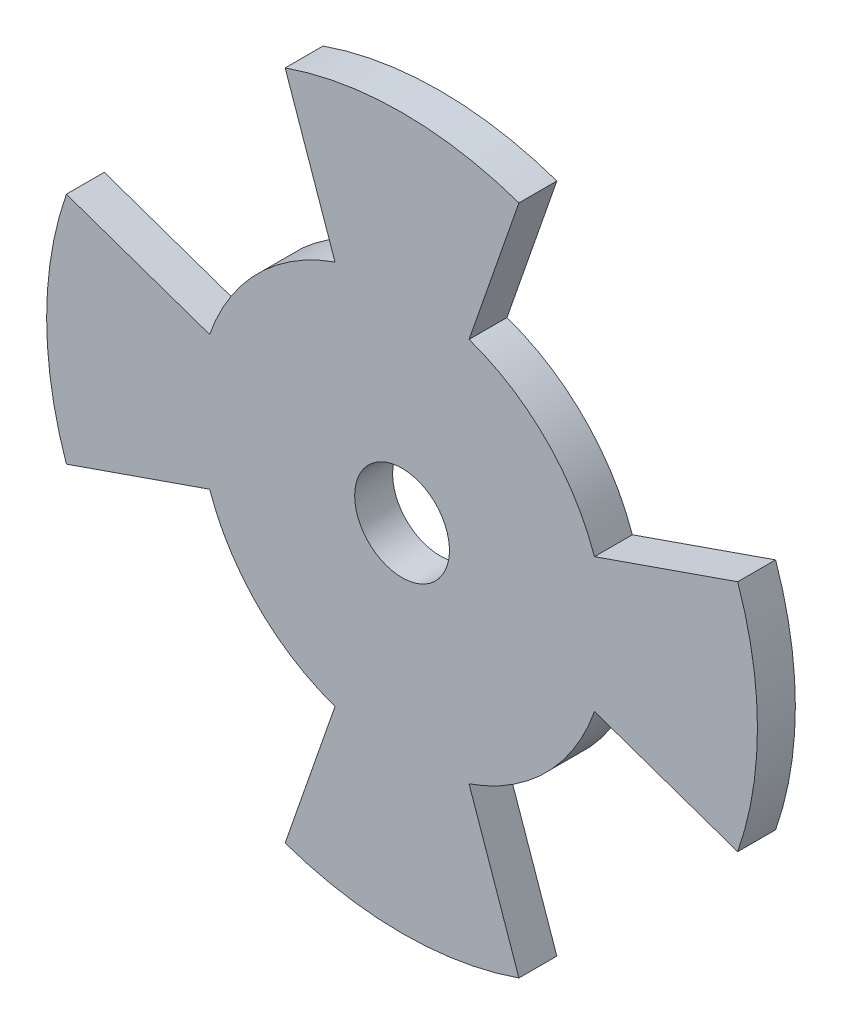
ISO-10303-21;
HEADER;
FILE_DESCRIPTION(('STEP AP214'),'2;1');
FILE_NAME('part.step','',(''),(''),'','','');
FILE_SCHEMA(('AUTOMOTIVE_DESIGN { 1 0 10303 214 1 1 1 1 }'));
ENDSEC;
DATA;
#1=APPLICATION_CONTEXT('core data for automotive mechanical design processes');
#2=APPLICATION_PROTOCOL_DEFINITION('international standard','automotive_design',2000,#1);
#3=PRODUCT_CONTEXT('',#1,'mechanical');
#4=PRODUCT('Part','Part','',(#3));
#5=PRODUCT_RELATED_PRODUCT_CATEGORY('part','',(#4));
#6=PRODUCT_DEFINITION_FORMATION('','',#4);
#7=PRODUCT_DEFINITION_CONTEXT('part definition',#1,'design');
#8=PRODUCT_DEFINITION('design','',#6,#7);
#9=PRODUCT_DEFINITION_SHAPE('','',#8);
#10=(LENGTH_UNIT() NAMED_UNIT(*) SI_UNIT(.MILLI.,.METRE.));
#11=(NAMED_UNIT(*) PLANE_ANGLE_UNIT() SI_UNIT($,.RADIAN.));
#12=(NAMED_UNIT(*) SI_UNIT($,.STERADIAN.) SOLID_ANGLE_UNIT());
#13=UNCERTAINTY_MEASURE_WITH_UNIT(LENGTH_MEASURE(1.E-05),#10,'distance_accuracy_value','');
#14=(GEOMETRIC_REPRESENTATION_CONTEXT(3) GLOBAL_UNCERTAINTY_ASSIGNED_CONTEXT((#13)) GLOBAL_UNIT_ASSIGNED_CONTEXT((#10,
#11,#12)) REPRESENTATION_CONTEXT('',''));
#15=CARTESIAN_POINT('',(0.,0.,0.));
#16=DIRECTION('',(0.,0.,1.));
#17=DIRECTION('',(1.,0.,0.));
#18=AXIS2_PLACEMENT_3D('',#15,#16,#17);
#19=CARTESIAN_POINT('',(0.,0.,2.));
#20=DIRECTION('',(0.,0.,-1.));
#21=DIRECTION('',(-1.,0.,0.));
#22=AXIS2_PLACEMENT_3D('',#19,#20,#21);
#23=CYLINDRICAL_SURFACE('',#22,18.75);
#24=CARTESIAN_POINT('',(0.,0.,0.));
#25=DIRECTION('',(0.,0.,1.));
#26=DIRECTION('',(1.,0.,0.));
#27=AXIS2_PLACEMENT_3D('',#24,#25,#26);
#28=CIRCLE('',#27,18.75);
#29=CARTESIAN_POINT('',(6.16703547130536,17.7067832622321,0.));
#30=VERTEX_POINT('',#29);
#31=CARTESIAN_POINT('',(-6.16703547130536,17.7067832622321,0.));
#32=VERTEX_POINT('',#31);
#33=EDGE_CURVE('E188',#30,#32,#28,.T.);
#34=ORIENTED_EDGE('',*,*,#33,.T.);
#35=DIRECTION('',(0.,0.,-1.));
#36=VECTOR('',#35,1.);
#37=CARTESIAN_POINT('',(-6.16703547130536,17.7067832622321,2.));
#38=LINE('',#37,#36);
#39=CARTESIAN_POINT('',(-6.16703547130536,17.7067832622321,2.));
#40=VERTEX_POINT('',#39);
#41=EDGE_CURVE('E11',#40,#32,#38,.T.);
#42=ORIENTED_EDGE('',*,*,#41,.F.);
#43=CARTESIAN_POINT('',(0.,0.,2.));
#44=DIRECTION('',(0.,0.,1.));
#45=DIRECTION('',(1.,0.,0.));
#46=AXIS2_PLACEMENT_3D('',#43,#44,#45);
#47=CIRCLE('',#46,18.75);
#48=CARTESIAN_POINT('',(6.16703547130536,17.7067832622321,2.));
#49=VERTEX_POINT('',#48);
#50=EDGE_CURVE('E235',#49,#40,#47,.T.);
#51=ORIENTED_EDGE('',*,*,#50,.F.);
#52=DIRECTION('',(0.,0.,-1.));
#53=VECTOR('',#52,1.);
#54=CARTESIAN_POINT('',(6.16703547130536,17.7067832622321,2.));
#55=LINE('',#54,#53);
#56=EDGE_CURVE('E184',#49,#30,#55,.T.);
#57=ORIENTED_EDGE('',*,*,#56,.T.);
#58=EDGE_LOOP('',(#34,#42,#51,#57));
#59=FACE_BOUND('',#58,.T.);
#60=ADVANCED_FACE('F39',(#59),#23,.T.);
#61=CARTESIAN_POINT('',(-3.53576700354841,10.1518890703464,2.));
#62=DIRECTION('',(0.94436177398571,0.328908558469619,0.));
#63=DIRECTION('',(-0.328908558469619,0.94436177398571,0.));
#64=AXIS2_PLACEMENT_3D('',#61,#62,#63);
#65=PLANE('',#64);
#66=DIRECTION('',(0.328908558469619,-0.94436177398571,0.));
#67=VECTOR('',#66,1.);
#68=CARTESIAN_POINT('',(-3.53576700354841,10.1518890703464,0.));
#69=LINE('',#68,#67);
#70=CARTESIAN_POINT('',(-3.53576700354841,10.1518890703464,0.));
#71=VERTEX_POINT('',#70);
#72=EDGE_CURVE('E192',#32,#71,#69,.T.);
#73=ORIENTED_EDGE('',*,*,#72,.T.);
#74=DIRECTION('',(0.,0.,-1.));
#75=VECTOR('',#74,1.);
#76=CARTESIAN_POINT('',(-3.53576700354841,10.1518890703464,2.));
#77=LINE('',#76,#75);
#78=CARTESIAN_POINT('',(-3.53576700354841,10.1518890703464,2.));
#79=VERTEX_POINT('',#78);
#80=EDGE_CURVE('E48',#79,#71,#77,.T.);
#81=ORIENTED_EDGE('',*,*,#80,.F.);
#82=DIRECTION('',(0.328908558469619,-0.94436177398571,0.));
#83=VECTOR('',#82,1.);
#84=CARTESIAN_POINT('',(-3.53576700354841,10.1518890703464,2.));
#85=LINE('',#84,#83);
#86=EDGE_CURVE('E123',#40,#79,#85,.T.);
#87=ORIENTED_EDGE('',*,*,#86,.F.);
#88=ORIENTED_EDGE('',*,*,#41,.T.);
#89=EDGE_LOOP('',(#73,#81,#87,#88));
#90=FACE_BOUND('',#89,.T.);
#91=ADVANCED_FACE('F358',(#90),#65,.F.);
#92=CARTESIAN_POINT('',(0.,0.,2.));
#93=DIRECTION('',(0.,0.,-1.));
#94=DIRECTION('',(-1.,0.,0.));
#95=AXIS2_PLACEMENT_3D('',#92,#93,#94);
#96=CYLINDRICAL_SURFACE('',#95,10.75);
#97=CARTESIAN_POINT('',(0.,0.,0.));
#98=DIRECTION('',(0.,0.,1.));
#99=DIRECTION('',(1.,0.,0.));
#100=AXIS2_PLACEMENT_3D('',#97,#98,#99);
#101=CIRCLE('',#100,10.75);
#102=CARTESIAN_POINT('',(-10.1518890703473,3.53576700354574,0.));
#103=VERTEX_POINT('',#102);
#104=EDGE_CURVE('E196',#71,#103,#101,.T.);
#105=ORIENTED_EDGE('',*,*,#104,.T.);
#106=DIRECTION('',(0.,0.,-1.));
#107=VECTOR('',#106,1.);
#108=CARTESIAN_POINT('',(-10.1518890703473,3.53576700354574,2.));
#109=LINE('',#108,#107);
#110=CARTESIAN_POINT('',(-10.1518890703473,3.53576700354574,2.));
#111=VERTEX_POINT('',#110);
#112=EDGE_CURVE('E278',#111,#103,#109,.T.);
#113=ORIENTED_EDGE('',*,*,#112,.F.);
#114=CARTESIAN_POINT('',(0.,0.,2.));
#115=DIRECTION('',(0.,0.,1.));
#116=DIRECTION('',(1.,0.,0.));
#117=AXIS2_PLACEMENT_3D('',#114,#115,#116);
#118=CIRCLE('',#117,10.75);
#119=EDGE_CURVE('E288',#79,#111,#118,.T.);
#120=ORIENTED_EDGE('',*,*,#119,.F.);
#121=ORIENTED_EDGE('',*,*,#80,.T.);
#122=EDGE_LOOP('',(#105,#113,#120,#121));
#123=FACE_BOUND('',#122,.T.);
#124=ADVANCED_FACE('F286',(#123),#96,.T.);
#125=CARTESIAN_POINT('',(-10.1518890703473,3.53576700354574,2.));
#126=DIRECTION('',(-0.328908558469371,-0.944361773985796,0.));
#127=DIRECTION('',(0.944361773985796,-0.328908558469371,0.));
#128=AXIS2_PLACEMENT_3D('',#125,#126,#127);
#129=PLANE('',#128);
#130=DIRECTION('',(-0.944361773985796,0.328908558469371,0.));
#131=VECTOR('',#130,1.);
#132=CARTESIAN_POINT('',(-10.1518890703473,3.53576700354574,0.));
#133=LINE('',#132,#131);
#134=CARTESIAN_POINT('',(-17.7067832622337,6.16703547130071,0.));
#135=VERTEX_POINT('',#134);
#136=EDGE_CURVE('E199',#103,#135,#133,.T.);
#137=ORIENTED_EDGE('',*,*,#136,.T.);
#138=DIRECTION('',(0.,0.,-1.));
#139=VECTOR('',#138,1.);
#140=CARTESIAN_POINT('',(-17.7067832622337,6.16703547130071,2.));
#141=LINE('',#140,#139);
#142=CARTESIAN_POINT('',(-17.7067832622337,6.16703547130071,2.));
#143=VERTEX_POINT('',#142);
#144=EDGE_CURVE('E274',#143,#135,#141,.T.);
#145=ORIENTED_EDGE('',*,*,#144,.F.);
#146=DIRECTION('',(-0.944361773985796,0.328908558469371,0.));
#147=VECTOR('',#146,1.);
#148=CARTESIAN_POINT('',(-10.1518890703473,3.53576700354574,2.));
#149=LINE('',#148,#147);
#150=EDGE_CURVE('E307',#111,#143,#149,.T.);
#151=ORIENTED_EDGE('',*,*,#150,.F.);
#152=ORIENTED_EDGE('',*,*,#112,.T.);
#153=EDGE_LOOP('',(#137,#145,#151,#152));
#154=FACE_BOUND('',#153,.T.);
#155=ADVANCED_FACE('F297',(#154),#129,.F.);
#156=CARTESIAN_POINT('',(0.,0.,2.));
#157=DIRECTION('',(0.,0.,-1.));
#158=DIRECTION('',(-1.,0.,0.));
#159=AXIS2_PLACEMENT_3D('',#156,#157,#158);
#160=CYLINDRICAL_SURFACE('',#159,18.75);
#161=CARTESIAN_POINT('',(0.,0.,0.));
#162=DIRECTION('',(0.,0.,1.));
#163=DIRECTION('',(1.,0.,0.));
#164=AXIS2_PLACEMENT_3D('',#161,#162,#163);
#165=CIRCLE('',#164,18.75);
#166=CARTESIAN_POINT('',(-17.7067832622298,-6.16703547131194,0.));
#167=VERTEX_POINT('',#166);
#168=EDGE_CURVE('E202',#135,#167,#165,.T.);
#169=ORIENTED_EDGE('',*,*,#168,.T.);
#170=DIRECTION('',(0.,0.,-1.));
#171=VECTOR('',#170,1.);
#172=CARTESIAN_POINT('',(-17.7067832622298,-6.16703547131194,2.));
#173=LINE('',#172,#171);
#174=CARTESIAN_POINT('',(-17.7067832622298,-6.16703547131194,2.));
#175=VERTEX_POINT('',#174);
#176=EDGE_CURVE('E270',#175,#167,#173,.T.);
#177=ORIENTED_EDGE('',*,*,#176,.F.);
#178=CARTESIAN_POINT('',(0.,0.,2.));
#179=DIRECTION('',(0.,0.,1.));
#180=DIRECTION('',(1.,0.,0.));
#181=AXIS2_PLACEMENT_3D('',#178,#179,#180);
#182=CIRCLE('',#181,18.75);
#183=EDGE_CURVE('E303',#143,#175,#182,.T.);
#184=ORIENTED_EDGE('',*,*,#183,.F.);
#185=ORIENTED_EDGE('',*,*,#144,.T.);
#186=EDGE_LOOP('',(#169,#177,#184,#185));
#187=FACE_BOUND('',#186,.T.);
#188=ADVANCED_FACE('F301',(#187),#160,.T.);
#189=CARTESIAN_POINT('',(-10.151889070344,-3.53576700355514,2.));
#190=DIRECTION('',(-0.3289085584696,0.944361773985717,0.));
#191=DIRECTION('',(-0.944361773985717,-0.3289085584696,0.));
#192=AXIS2_PLACEMENT_3D('',#189,#190,#191);
#193=PLANE('',#192);
#194=DIRECTION('',(0.944361773985717,0.3289085584696,0.));
#195=VECTOR('',#194,1.);
#196=CARTESIAN_POINT('',(-10.151889070344,-3.53576700355514,0.));
#197=LINE('',#196,#195);
#198=CARTESIAN_POINT('',(-10.151889070344,-3.53576700355514,0.));
#199=VERTEX_POINT('',#198);
#200=EDGE_CURVE('E205',#167,#199,#197,.T.);
#201=ORIENTED_EDGE('',*,*,#200,.T.);
#202=DIRECTION('',(0.,0.,-1.));
#203=VECTOR('',#202,1.);
#204=CARTESIAN_POINT('',(-10.151889070344,-3.53576700355514,2.));
#205=LINE('',#204,#203);
#206=CARTESIAN_POINT('',(-10.151889070344,-3.53576700355514,2.));
#207=VERTEX_POINT('',#206);
#208=EDGE_CURVE('E266',#207,#199,#205,.T.);
#209=ORIENTED_EDGE('',*,*,#208,.F.);
#210=DIRECTION('',(0.944361773985717,0.3289085584696,0.));
#211=VECTOR('',#210,1.);
#212=CARTESIAN_POINT('',(-10.151889070344,-3.53576700355514,2.));
#213=LINE('',#212,#211);
#214=EDGE_CURVE('E306',#175,#207,#213,.T.);
#215=ORIENTED_EDGE('',*,*,#214,.F.);
#216=ORIENTED_EDGE('',*,*,#176,.T.);
#217=EDGE_LOOP('',(#201,#209,#215,#216));
#218=FACE_BOUND('',#217,.T.);
#219=ADVANCED_FACE('F371',(#218),#193,.F.);
#220=CARTESIAN_POINT('',(0.,0.,2.));
#221=DIRECTION('',(0.,0.,-1.));
#222=DIRECTION('',(-1.,0.,0.));
#223=AXIS2_PLACEMENT_3D('',#220,#221,#222);
#224=CYLINDRICAL_SURFACE('',#223,10.75);
#225=CARTESIAN_POINT('',(0.,0.,0.));
#226=DIRECTION('',(0.,0.,1.));
#227=DIRECTION('',(1.,0.,0.));
#228=AXIS2_PLACEMENT_3D('',#225,#226,#227);
#229=CIRCLE('',#228,10.75);
#230=CARTESIAN_POINT('',(-3.53576700354096,-10.151889070349,0.));
#231=VERTEX_POINT('',#230);
#232=EDGE_CURVE('E208',#199,#231,#229,.T.);
#233=ORIENTED_EDGE('',*,*,#232,.T.);
#234=DIRECTION('',(0.,0.,-1.));
#235=VECTOR('',#234,1.);
#236=CARTESIAN_POINT('',(-3.53576700354096,-10.151889070349,2.));
#237=LINE('',#236,#235);
#238=CARTESIAN_POINT('',(-3.53576700354096,-10.151889070349,2.));
#239=VERTEX_POINT('',#238);
#240=EDGE_CURVE('E262',#239,#231,#237,.T.);
#241=ORIENTED_EDGE('',*,*,#240,.F.);
#242=CARTESIAN_POINT('',(0.,0.,2.));
#243=DIRECTION('',(0.,0.,1.));
#244=DIRECTION('',(1.,0.,0.));
#245=AXIS2_PLACEMENT_3D('',#242,#243,#244);
#246=CIRCLE('',#245,10.75);
#247=EDGE_CURVE('E311',#207,#239,#246,.T.);
#248=ORIENTED_EDGE('',*,*,#247,.F.);
#249=ORIENTED_EDGE('',*,*,#208,.T.);
#250=EDGE_LOOP('',(#233,#241,#248,#249));
#251=FACE_BOUND('',#250,.T.);
#252=ADVANCED_FACE('F374',(#251),#224,.T.);
#253=CARTESIAN_POINT('',(-3.53576700354095,-10.151889070349,2.));
#254=DIRECTION('',(0.944361773985794,-0.328908558469379,0.));
#255=DIRECTION('',(0.328908558469379,0.944361773985794,0.));
#256=AXIS2_PLACEMENT_3D('',#253,#254,#255);
#257=PLANE('',#256);
#258=DIRECTION('',(-0.328908558469379,-0.944361773985794,0.));
#259=VECTOR('',#258,1.);
#260=CARTESIAN_POINT('',(-3.53576700354095,-10.151889070349,0.));
#261=LINE('',#260,#259);
#262=CARTESIAN_POINT('',(-6.16703547129598,-17.7067832622353,0.));
#263=VERTEX_POINT('',#262);
#264=EDGE_CURVE('E211',#231,#263,#261,.T.);
#265=ORIENTED_EDGE('',*,*,#264,.T.);
#266=DIRECTION('',(0.,0.,-1.));
#267=VECTOR('',#266,1.);
#268=CARTESIAN_POINT('',(-6.16703547129598,-17.7067832622353,2.));
#269=LINE('',#268,#267);
#270=CARTESIAN_POINT('',(-6.16703547129598,-17.7067832622353,2.));
#271=VERTEX_POINT('',#270);
#272=EDGE_CURVE('E258',#271,#263,#269,.T.);
#273=ORIENTED_EDGE('',*,*,#272,.F.);
#274=DIRECTION('',(-0.328908558469379,-0.944361773985794,0.));
#275=VECTOR('',#274,1.);
#276=CARTESIAN_POINT('',(-3.53576700354095,-10.151889070349,2.));
#277=LINE('',#276,#275);
#278=EDGE_CURVE('E318',#239,#271,#277,.T.);
#279=ORIENTED_EDGE('',*,*,#278,.F.);
#280=ORIENTED_EDGE('',*,*,#240,.T.);
#281=EDGE_LOOP('',(#265,#273,#279,#280));
#282=FACE_BOUND('',#281,.T.);
#283=ADVANCED_FACE('F378',(#282),#257,.F.);
#284=CARTESIAN_POINT('',(0.,0.,2.));
#285=DIRECTION('',(0.,0.,-1.));
#286=DIRECTION('',(-1.,0.,0.));
#287=AXIS2_PLACEMENT_3D('',#284,#285,#286);
#288=CYLINDRICAL_SURFACE('',#287,18.75);
#289=CARTESIAN_POINT('',(0.,0.,0.));
#290=DIRECTION('',(0.,0.,1.));
#291=DIRECTION('',(1.,0.,0.));
#292=AXIS2_PLACEMENT_3D('',#289,#290,#291);
#293=CIRCLE('',#292,18.75);
#294=CARTESIAN_POINT('',(6.16703547131277,-17.7067832622295,0.));
#295=VERTEX_POINT('',#294);
#296=EDGE_CURVE('E214',#263,#295,#293,.T.);
#297=ORIENTED_EDGE('',*,*,#296,.T.);
#298=DIRECTION('',(0.,0.,-1.));
#299=VECTOR('',#298,1.);
#300=CARTESIAN_POINT('',(6.16703547131277,-17.7067832622295,2.));
#301=LINE('',#300,#299);
#302=CARTESIAN_POINT('',(6.16703547131277,-17.7067832622295,2.));
#303=VERTEX_POINT('',#302);
#304=EDGE_CURVE('E254',#303,#295,#301,.T.);
#305=ORIENTED_EDGE('',*,*,#304,.F.);
#306=CARTESIAN_POINT('',(0.,0.,2.));
#307=DIRECTION('',(0.,0.,1.));
#308=DIRECTION('',(1.,0.,0.));
#309=AXIS2_PLACEMENT_3D('',#306,#307,#308);
#310=CIRCLE('',#309,18.75);
#311=EDGE_CURVE('E321',#271,#303,#310,.T.);
#312=ORIENTED_EDGE('',*,*,#311,.F.);
#313=ORIENTED_EDGE('',*,*,#272,.T.);
#314=EDGE_LOOP('',(#297,#305,#312,#313));
#315=FACE_BOUND('',#314,.T.);
#316=ADVANCED_FACE('F382',(#315),#288,.T.);
#317=CARTESIAN_POINT('',(3.53576700355592,-10.1518890703438,2.));
#318=DIRECTION('',(-0.944361773985714,-0.328908558469607,0.));
#319=DIRECTION('',(0.328908558469607,-0.944361773985714,0.));
#320=AXIS2_PLACEMENT_3D('',#317,#318,#319);
#321=PLANE('',#320);
#322=DIRECTION('',(-0.328908558469607,0.944361773985714,0.));
#323=VECTOR('',#322,1.);
#324=CARTESIAN_POINT('',(3.53576700355592,-10.1518890703438,0.));
#325=LINE('',#324,#323);
#326=CARTESIAN_POINT('',(3.53576700355592,-10.1518890703438,0.));
#327=VERTEX_POINT('',#326);
#328=EDGE_CURVE('E217',#295,#327,#325,.T.);
#329=ORIENTED_EDGE('',*,*,#328,.T.);
#330=DIRECTION('',(0.,0.,-1.));
#331=VECTOR('',#330,1.);
#332=CARTESIAN_POINT('',(3.53576700355592,-10.1518890703438,2.));
#333=LINE('',#332,#331);
#334=CARTESIAN_POINT('',(3.53576700355592,-10.1518890703438,2.));
#335=VERTEX_POINT('',#334);
#336=EDGE_CURVE('E250',#335,#327,#333,.T.);
#337=ORIENTED_EDGE('',*,*,#336,.F.);
#338=DIRECTION('',(-0.328908558469607,0.944361773985714,0.));
#339=VECTOR('',#338,1.);
#340=CARTESIAN_POINT('',(3.53576700355592,-10.1518890703438,2.));
#341=LINE('',#340,#339);
#342=EDGE_CURVE('E324',#303,#335,#341,.T.);
#343=ORIENTED_EDGE('',*,*,#342,.F.);
#344=ORIENTED_EDGE('',*,*,#304,.T.);
#345=EDGE_LOOP('',(#329,#337,#343,#344));
#346=FACE_BOUND('',#345,.T.);
#347=ADVANCED_FACE('F386',(#346),#321,.F.);
#348=CARTESIAN_POINT('',(0.,0.,2.));
#349=DIRECTION('',(0.,0.,-1.));
#350=DIRECTION('',(-1.,0.,0.));
#351=AXIS2_PLACEMENT_3D('',#348,#349,#350);
#352=CYLINDRICAL_SURFACE('',#351,10.75);
#353=CARTESIAN_POINT('',(0.,0.,0.));
#354=DIRECTION('',(0.,0.,1.));
#355=DIRECTION('',(1.,0.,0.));
#356=AXIS2_PLACEMENT_3D('',#353,#354,#355);
#357=CIRCLE('',#356,10.75);
#358=CARTESIAN_POINT('',(10.1518890703473,-3.53576700354574,0.));
#359=VERTEX_POINT('',#358);
#360=EDGE_CURVE('E220',#327,#359,#357,.T.);
#361=ORIENTED_EDGE('',*,*,#360,.T.);
#362=DIRECTION('',(0.,0.,-1.));
#363=VECTOR('',#362,1.);
#364=CARTESIAN_POINT('',(10.1518890703473,-3.53576700354574,2.));
#365=LINE('',#364,#363);
#366=CARTESIAN_POINT('',(10.1518890703473,-3.53576700354574,2.));
#367=VERTEX_POINT('',#366);
#368=EDGE_CURVE('E246',#367,#359,#365,.T.);
#369=ORIENTED_EDGE('',*,*,#368,.F.);
#370=CARTESIAN_POINT('',(0.,0.,2.));
#371=DIRECTION('',(0.,0.,1.));
#372=DIRECTION('',(1.,0.,0.));
#373=AXIS2_PLACEMENT_3D('',#370,#371,#372);
#374=CIRCLE('',#373,10.75);
#375=EDGE_CURVE('E327',#335,#367,#374,.T.);
#376=ORIENTED_EDGE('',*,*,#375,.F.);
#377=ORIENTED_EDGE('',*,*,#336,.T.);
#378=EDGE_LOOP('',(#361,#369,#376,#377));
#379=FACE_BOUND('',#378,.T.);
#380=ADVANCED_FACE('F390',(#379),#352,.T.);
#381=CARTESIAN_POINT('',(10.1518890703473,-3.53576700354574,2.));
#382=DIRECTION('',(0.328908558469359,0.944361773985801,0.));
#383=DIRECTION('',(-0.944361773985801,0.328908558469359,0.));
#384=AXIS2_PLACEMENT_3D('',#381,#382,#383);
#385=PLANE('',#384);
#386=DIRECTION('',(0.944361773985801,-0.328908558469359,0.));
#387=VECTOR('',#386,1.);
#388=CARTESIAN_POINT('',(10.1518890703473,-3.53576700354574,0.));
#389=LINE('',#388,#387);
#390=CARTESIAN_POINT('',(17.7067832622337,-6.16703547130061,0.));
#391=VERTEX_POINT('',#390);
#392=EDGE_CURVE('E223',#359,#391,#389,.T.);
#393=ORIENTED_EDGE('',*,*,#392,.T.);
#394=DIRECTION('',(0.,0.,-1.));
#395=VECTOR('',#394,1.);
#396=CARTESIAN_POINT('',(17.7067832622337,-6.16703547130061,2.));
#397=LINE('',#396,#395);
#398=CARTESIAN_POINT('',(17.7067832622337,-6.16703547130061,2.));
#399=VERTEX_POINT('',#398);
#400=EDGE_CURVE('E242',#399,#391,#397,.T.);
#401=ORIENTED_EDGE('',*,*,#400,.F.);
#402=DIRECTION('',(0.944361773985801,-0.328908558469359,0.));
#403=VECTOR('',#402,1.);
#404=CARTESIAN_POINT('',(10.1518890703473,-3.53576700354574,2.));
#405=LINE('',#404,#403);
#406=EDGE_CURVE('E330',#367,#399,#405,.T.);
#407=ORIENTED_EDGE('',*,*,#406,.F.);
#408=ORIENTED_EDGE('',*,*,#368,.T.);
#409=EDGE_LOOP('',(#393,#401,#407,#408));
#410=FACE_BOUND('',#409,.T.);
#411=ADVANCED_FACE('F338',(#410),#385,.F.);
#412=CARTESIAN_POINT('',(0.,0.,2.));
#413=DIRECTION('',(0.,0.,-1.));
#414=DIRECTION('',(-1.,0.,0.));
#415=AXIS2_PLACEMENT_3D('',#412,#413,#414);
#416=CYLINDRICAL_SURFACE('',#415,18.75);
#417=CARTESIAN_POINT('',(0.,0.,0.));
#418=DIRECTION('',(0.,0.,1.));
#419=DIRECTION('',(1.,0.,0.));
#420=AXIS2_PLACEMENT_3D('',#417,#418,#419);
#421=CIRCLE('',#420,18.75);
#422=CARTESIAN_POINT('',(17.7067832622318,6.1670354713062,0.));
#423=VERTEX_POINT('',#422);
#424=EDGE_CURVE('E226',#391,#423,#421,.T.);
#425=ORIENTED_EDGE('',*,*,#424,.T.);
#426=DIRECTION('',(0.,0.,-1.));
#427=VECTOR('',#426,1.);
#428=CARTESIAN_POINT('',(17.7067832622318,6.1670354713062,2.));
#429=LINE('',#428,#427);
#430=CARTESIAN_POINT('',(17.7067832622318,6.1670354713062,2.));
#431=VERTEX_POINT('',#430);
#432=EDGE_CURVE('E177',#431,#423,#429,.T.);
#433=ORIENTED_EDGE('',*,*,#432,.F.);
#434=CARTESIAN_POINT('',(0.,0.,2.));
#435=DIRECTION('',(0.,0.,1.));
#436=DIRECTION('',(1.,0.,0.));
#437=AXIS2_PLACEMENT_3D('',#434,#435,#436);
#438=CIRCLE('',#437,18.75);
#439=EDGE_CURVE('E166',#399,#431,#438,.T.);
#440=ORIENTED_EDGE('',*,*,#439,.F.);
#441=ORIENTED_EDGE('',*,*,#400,.T.);
#442=EDGE_LOOP('',(#425,#433,#440,#441));
#443=FACE_BOUND('',#442,.T.);
#444=ADVANCED_FACE('F342',(#443),#416,.T.);
#445=CARTESIAN_POINT('',(10.1518890703461,3.53576700354919,2.));
#446=DIRECTION('',(0.328908558469626,-0.944361773985708,0.));
#447=DIRECTION('',(0.944361773985708,0.328908558469626,0.));
#448=AXIS2_PLACEMENT_3D('',#445,#446,#447);
#449=PLANE('',#448);
#450=DIRECTION('',(-0.944361773985708,-0.328908558469626,0.));
#451=VECTOR('',#450,1.);
#452=CARTESIAN_POINT('',(10.1518890703461,3.53576700354919,0.));
#453=LINE('',#452,#451);
#454=CARTESIAN_POINT('',(10.1518890703461,3.53576700354919,0.));
#455=VERTEX_POINT('',#454);
#456=EDGE_CURVE('E175',#423,#455,#453,.T.);
#457=ORIENTED_EDGE('',*,*,#456,.T.);
#458=DIRECTION('',(0.,0.,-1.));
#459=VECTOR('',#458,1.);
#460=CARTESIAN_POINT('',(10.1518890703461,3.53576700354919,2.));
#461=LINE('',#460,#459);
#462=CARTESIAN_POINT('',(10.1518890703461,3.53576700354919,2.));
#463=VERTEX_POINT('',#462);
#464=EDGE_CURVE('E172',#463,#455,#461,.T.);
#465=ORIENTED_EDGE('',*,*,#464,.F.);
#466=DIRECTION('',(-0.944361773985708,-0.328908558469626,0.));
#467=VECTOR('',#466,1.);
#468=CARTESIAN_POINT('',(10.1518890703461,3.53576700354919,2.));
#469=LINE('',#468,#467);
#470=EDGE_CURVE('E160',#431,#463,#469,.T.);
#471=ORIENTED_EDGE('',*,*,#470,.F.);
#472=ORIENTED_EDGE('',*,*,#432,.T.);
#473=EDGE_LOOP('',(#457,#465,#471,#472));
#474=FACE_BOUND('',#473,.T.);
#475=ADVANCED_FACE('F173',(#474),#449,.F.);
#476=CARTESIAN_POINT('',(0.,0.,2.));
#477=DIRECTION('',(0.,0.,-1.));
#478=DIRECTION('',(-1.,0.,0.));
#479=AXIS2_PLACEMENT_3D('',#476,#477,#478);
#480=CYLINDRICAL_SURFACE('',#479,10.75);
#481=CARTESIAN_POINT('',(0.,0.,0.));
#482=DIRECTION('',(0.,0.,1.));
#483=DIRECTION('',(1.,0.,0.));
#484=AXIS2_PLACEMENT_3D('',#481,#482,#483);
#485=CIRCLE('',#484,10.75);
#486=CARTESIAN_POINT('',(3.53576700355053,10.1518890703456,0.));
#487=VERTEX_POINT('',#486);
#488=EDGE_CURVE('E109',#455,#487,#485,.T.);
#489=ORIENTED_EDGE('',*,*,#488,.T.);
#490=DIRECTION('',(0.,0.,-1.));
#491=VECTOR('',#490,1.);
#492=CARTESIAN_POINT('',(3.53576700355053,10.1518890703456,2.));
#493=LINE('',#492,#491);
#494=CARTESIAN_POINT('',(3.53576700355053,10.1518890703456,2.));
#495=VERTEX_POINT('',#494);
#496=EDGE_CURVE('E178',#495,#487,#493,.T.);
#497=ORIENTED_EDGE('',*,*,#496,.F.);
#498=CARTESIAN_POINT('',(0.,0.,2.));
#499=DIRECTION('',(0.,0.,1.));
#500=DIRECTION('',(1.,0.,0.));
#501=AXIS2_PLACEMENT_3D('',#498,#499,#500);
#502=CIRCLE('',#501,10.75);
#503=EDGE_CURVE('E164',#463,#495,#502,.T.);
#504=ORIENTED_EDGE('',*,*,#503,.F.);
#505=ORIENTED_EDGE('',*,*,#464,.T.);
#506=EDGE_LOOP('',(#489,#497,#504,#505));
#507=FACE_BOUND('',#506,.T.);
#508=ADVANCED_FACE('F180',(#507),#480,.T.);
#509=CARTESIAN_POINT('',(3.53576700355053,10.1518890703456,2.));
#510=DIRECTION('',(-0.944361773985803,0.328908558469354,0.));
#511=DIRECTION('',(-0.328908558469354,-0.944361773985803,0.));
#512=AXIS2_PLACEMENT_3D('',#509,#510,#511);
#513=PLANE('',#512);
#514=DIRECTION('',(0.328908558469354,0.944361773985802,0.));
#515=VECTOR('',#514,1.);
#516=CARTESIAN_POINT('',(3.53576700355053,10.1518890703456,0.));
#517=LINE('',#516,#515);
#518=EDGE_CURVE('E115',#487,#30,#517,.T.);
#519=ORIENTED_EDGE('',*,*,#518,.T.);
#520=ORIENTED_EDGE('',*,*,#56,.F.);
#521=DIRECTION('',(0.328908558469354,0.944361773985802,0.));
#522=VECTOR('',#521,1.);
#523=CARTESIAN_POINT('',(3.53576700355053,10.1518890703456,2.));
#524=LINE('',#523,#522);
#525=EDGE_CURVE('E56',#495,#49,#524,.T.);
#526=ORIENTED_EDGE('',*,*,#525,.F.);
#527=ORIENTED_EDGE('',*,*,#496,.T.);
#528=EDGE_LOOP('',(#519,#520,#526,#527));
#529=FACE_BOUND('',#528,.T.);
#530=ADVANCED_FACE('F346',(#529),#513,.F.);
#531=CARTESIAN_POINT('',(0.,0.,2.));
#532=DIRECTION('',(0.,0.,1.));
#533=DIRECTION('',(1.,0.,0.));
#534=AXIS2_PLACEMENT_3D('',#531,#532,#533);
#535=PLANE('',#534);
#536=CARTESIAN_POINT('',(0.,0.,2.));
#537=DIRECTION('',(0.,0.,-1.));
#538=DIRECTION('',(-1.,0.,0.));
#539=AXIS2_PLACEMENT_3D('',#536,#537,#538);
#540=CIRCLE('',#539,2.5);
#541=CARTESIAN_POINT('',(-2.5,0.,2.));
#542=VERTEX_POINT('',#541);
#543=EDGE_CURVE('E193',#542,#542,#540,.T.);
#544=ORIENTED_EDGE('',*,*,#543,.T.);
#545=EDGE_LOOP('',(#544));
#546=FACE_BOUND('',#545,.T.);
#547=ORIENTED_EDGE('',*,*,#50,.T.);
#548=ORIENTED_EDGE('',*,*,#86,.T.);
#549=ORIENTED_EDGE('',*,*,#119,.T.);
#550=ORIENTED_EDGE('',*,*,#150,.T.);
#551=ORIENTED_EDGE('',*,*,#183,.T.);
#552=ORIENTED_EDGE('',*,*,#214,.T.);
#553=ORIENTED_EDGE('',*,*,#247,.T.);
#554=ORIENTED_EDGE('',*,*,#278,.T.);
#555=ORIENTED_EDGE('',*,*,#311,.T.);
#556=ORIENTED_EDGE('',*,*,#342,.T.);
#557=ORIENTED_EDGE('',*,*,#375,.T.);
#558=ORIENTED_EDGE('',*,*,#406,.T.);
#559=ORIENTED_EDGE('',*,*,#439,.T.);
#560=ORIENTED_EDGE('',*,*,#470,.T.);
#561=ORIENTED_EDGE('',*,*,#503,.T.);
#562=ORIENTED_EDGE('',*,*,#525,.T.);
#563=EDGE_LOOP('',(#547,#548,#549,#550,#551,#552,#553,#554,#555,#556,#557,#558,#559,#560,#561,#562));
#564=FACE_BOUND('',#563,.T.);
#565=ADVANCED_FACE('F162',(#546,#564),#535,.T.);
#566=CARTESIAN_POINT('',(0.,0.,0.));
#567=DIRECTION('',(0.,0.,1.));
#568=DIRECTION('',(1.,0.,0.));
#569=AXIS2_PLACEMENT_3D('',#566,#567,#568);
#570=PLANE('',#569);
#571=CARTESIAN_POINT('',(0.,0.,0.));
#572=DIRECTION('',(0.,0.,-1.));
#573=DIRECTION('',(-1.,0.,0.));
#574=AXIS2_PLACEMENT_3D('',#571,#572,#573);
#575=CIRCLE('',#574,2.5);
#576=CARTESIAN_POINT('',(-2.5,0.,0.));
#577=VERTEX_POINT('',#576);
#578=EDGE_CURVE('E445',#577,#577,#575,.T.);
#579=ORIENTED_EDGE('',*,*,#578,.F.);
#580=EDGE_LOOP('',(#579));
#581=FACE_BOUND('',#580,.T.);
#582=ORIENTED_EDGE('',*,*,#33,.F.);
#583=ORIENTED_EDGE('',*,*,#518,.F.);
#584=ORIENTED_EDGE('',*,*,#488,.F.);
#585=ORIENTED_EDGE('',*,*,#456,.F.);
#586=ORIENTED_EDGE('',*,*,#424,.F.);
#587=ORIENTED_EDGE('',*,*,#392,.F.);
#588=ORIENTED_EDGE('',*,*,#360,.F.);
#589=ORIENTED_EDGE('',*,*,#328,.F.);
#590=ORIENTED_EDGE('',*,*,#296,.F.);
#591=ORIENTED_EDGE('',*,*,#264,.F.);
#592=ORIENTED_EDGE('',*,*,#232,.F.);
#593=ORIENTED_EDGE('',*,*,#200,.F.);
#594=ORIENTED_EDGE('',*,*,#168,.F.);
#595=ORIENTED_EDGE('',*,*,#136,.F.);
#596=ORIENTED_EDGE('',*,*,#104,.F.);
#597=ORIENTED_EDGE('',*,*,#72,.F.);
#598=EDGE_LOOP('',(#582,#583,#584,#585,#586,#587,#588,#589,#590,#591,#592,#593,#594,#595,#596,#597));
#599=FACE_BOUND('',#598,.T.);
#600=ADVANCED_FACE('F292',(#581,#599),#570,.F.);
#601=CARTESIAN_POINT('',(0.,0.,2.));
#602=DIRECTION('',(0.,0.,-1.));
#603=DIRECTION('',(-1.,0.,0.));
#604=AXIS2_PLACEMENT_3D('',#601,#602,#603);
#605=CYLINDRICAL_SURFACE('',#604,2.5);
#606=ORIENTED_EDGE('',*,*,#543,.F.);
#607=EDGE_LOOP('',(#606));
#608=FACE_BOUND('',#607,.T.);
#609=ORIENTED_EDGE('',*,*,#578,.T.);
#610=EDGE_LOOP('',(#609));
#611=FACE_BOUND('',#610,.T.);
#612=ADVANCED_FACE('F427',(#608,#611),#605,.F.);
#613=CLOSED_SHELL('',(#60,#91,#124,#155,#188,#219,#252,#283,#316,#347,#380,#411,#444,#475,#508,
#530,#565,#600,#612));
#614=MANIFOLD_SOLID_BREP('B2',#613);
#615=ADVANCED_BREP_SHAPE_REPRESENTATION('',(#18,#614),#14);
#616=SHAPE_DEFINITION_REPRESENTATION(#9,#615);
ENDSEC;
END-ISO-10303-21;
